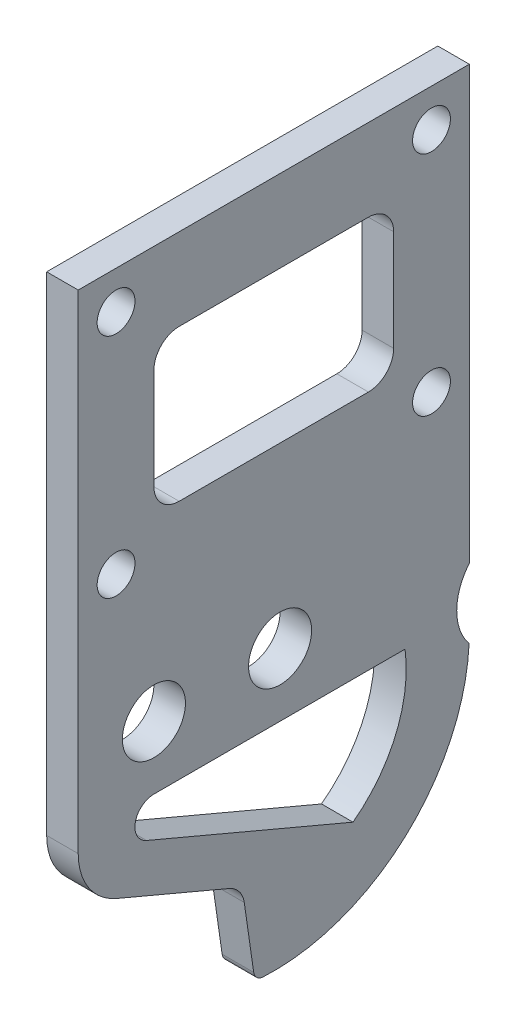
ISO-10303-21;
HEADER;
FILE_DESCRIPTION(('STEP AP214'),'2;1');
FILE_NAME('part.step','',(''),(''),'','','');
FILE_SCHEMA(('AUTOMOTIVE_DESIGN { 1 0 10303 214 1 1 1 1 }'));
ENDSEC;
DATA;
#1=APPLICATION_CONTEXT('core data for automotive mechanical design processes');
#2=APPLICATION_PROTOCOL_DEFINITION('international standard','automotive_design',2000,#1);
#3=PRODUCT_CONTEXT('',#1,'mechanical');
#4=PRODUCT('Part','Part','',(#3));
#5=PRODUCT_RELATED_PRODUCT_CATEGORY('part','',(#4));
#6=PRODUCT_DEFINITION_FORMATION('','',#4);
#7=PRODUCT_DEFINITION_CONTEXT('part definition',#1,'design');
#8=PRODUCT_DEFINITION('design','',#6,#7);
#9=PRODUCT_DEFINITION_SHAPE('','',#8);
#10=(LENGTH_UNIT() NAMED_UNIT(*) SI_UNIT(.MILLI.,.METRE.));
#11=(NAMED_UNIT(*) PLANE_ANGLE_UNIT() SI_UNIT($,.RADIAN.));
#12=(NAMED_UNIT(*) SI_UNIT($,.STERADIAN.) SOLID_ANGLE_UNIT());
#13=UNCERTAINTY_MEASURE_WITH_UNIT(LENGTH_MEASURE(1.E-05),#10,'distance_accuracy_value','');
#14=(GEOMETRIC_REPRESENTATION_CONTEXT(3) GLOBAL_UNCERTAINTY_ASSIGNED_CONTEXT((#13)) GLOBAL_UNIT_ASSIGNED_CONTEXT((#10,
#11,#12)) REPRESENTATION_CONTEXT('',''));
#15=CARTESIAN_POINT('',(0.,0.,0.));
#16=DIRECTION('',(0.,0.,1.));
#17=DIRECTION('',(1.,0.,0.));
#18=AXIS2_PLACEMENT_3D('',#15,#16,#17);
#19=CARTESIAN_POINT('',(-1.25,-26.4282241632523,0.799834616227528));
#20=DIRECTION('',(1.,0.,0.));
#21=DIRECTION('',(0.,0.,-1.));
#22=AXIS2_PLACEMENT_3D('',#19,#20,#21);
#23=CYLINDRICAL_SURFACE('',#22,0.8);
#24=CARTESIAN_POINT('',(1.25,-26.4282241632523,0.799834616227528));
#25=DIRECTION('',(1.,0.,0.));
#26=DIRECTION('',(0.,0.,-1.));
#27=AXIS2_PLACEMENT_3D('',#24,#25,#26);
#28=CIRCLE('',#27,0.8);
#29=CARTESIAN_POINT('',(1.25,-26.5425253052086,1.59162704417029));
#30=VERTEX_POINT('',#29);
#31=CARTESIAN_POINT('',(1.25,-27.2270390837014,0.843363030716107));
#32=VERTEX_POINT('',#31);
#33=EDGE_CURVE('E166',#30,#32,#28,.T.);
#34=ORIENTED_EDGE('',*,*,#33,.F.);
#35=DIRECTION('',(1.,0.,0.));
#36=VECTOR('',#35,1.);
#37=CARTESIAN_POINT('',(-1.25,-26.5425253052086,1.59162704417028));
#38=LINE('',#37,#36);
#39=CARTESIAN_POINT('',(-1.25,-26.5425253052086,1.59162704417029));
#40=VERTEX_POINT('',#39);
#41=EDGE_CURVE('E164',#40,#30,#38,.T.);
#42=ORIENTED_EDGE('',*,*,#41,.F.);
#43=CARTESIAN_POINT('',(-1.25,-26.4282241632523,0.799834616227528));
#44=DIRECTION('',(1.,0.,0.));
#45=DIRECTION('',(0.,0.,-1.));
#46=AXIS2_PLACEMENT_3D('',#43,#44,#45);
#47=CIRCLE('',#46,0.8);
#48=CARTESIAN_POINT('',(-1.25,-27.2270390837014,0.843363030716107));
#49=VERTEX_POINT('',#48);
#50=EDGE_CURVE('E20',#40,#49,#47,.T.);
#51=ORIENTED_EDGE('',*,*,#50,.T.);
#52=DIRECTION('',(1.,0.,0.));
#53=VECTOR('',#52,1.);
#54=CARTESIAN_POINT('',(-1.25,-27.2270390837014,0.843363030716113));
#55=LINE('',#54,#53);
#56=EDGE_CURVE('E163',#32,#49,#55,.F.);
#57=ORIENTED_EDGE('',*,*,#56,.F.);
#58=EDGE_LOOP('',(#34,#42,#51,#57));
#59=FACE_BOUND('',#58,.T.);
#60=ADVANCED_FACE('F17',(#59),#23,.T.);
#61=CARTESIAN_POINT('',(1.25,0.,0.));
#62=DIRECTION('',(1.,0.,0.));
#63=DIRECTION('',(0.,0.,-1.));
#64=AXIS2_PLACEMENT_3D('',#61,#62,#63);
#65=PLANE('',#64);
#66=CARTESIAN_POINT('',(1.25,6.25,-12.5));
#67=DIRECTION('',(1.,0.,0.));
#68=DIRECTION('',(0.,0.,-1.));
#69=AXIS2_PLACEMENT_3D('',#66,#67,#68);
#70=CIRCLE('',#69,1.5);
#71=CARTESIAN_POINT('',(1.25,6.25,-14.));
#72=VERTEX_POINT('',#71);
#73=EDGE_CURVE('E193',#72,#72,#70,.F.);
#74=ORIENTED_EDGE('',*,*,#73,.T.);
#75=EDGE_LOOP('',(#74));
#76=FACE_BOUND('',#75,.T.);
#77=CARTESIAN_POINT('',(1.25,24.25,-12.5));
#78=DIRECTION('',(1.,0.,0.));
#79=DIRECTION('',(0.,0.,-1.));
#80=AXIS2_PLACEMENT_3D('',#77,#78,#79);
#81=CIRCLE('',#80,1.5);
#82=CARTESIAN_POINT('',(1.25,24.25,-14.));
#83=VERTEX_POINT('',#82);
#84=EDGE_CURVE('E196',#83,#83,#81,.F.);
#85=ORIENTED_EDGE('',*,*,#84,.T.);
#86=EDGE_LOOP('',(#85));
#87=FACE_BOUND('',#86,.T.);
#88=CARTESIAN_POINT('',(1.25,24.25,12.5));
#89=DIRECTION('',(1.,0.,0.));
#90=DIRECTION('',(0.,0.,-1.));
#91=AXIS2_PLACEMENT_3D('',#88,#89,#90);
#92=CIRCLE('',#91,1.5);
#93=CARTESIAN_POINT('',(1.25,24.25,11.));
#94=VERTEX_POINT('',#93);
#95=EDGE_CURVE('E201',#94,#94,#92,.F.);
#96=ORIENTED_EDGE('',*,*,#95,.T.);
#97=EDGE_LOOP('',(#96));
#98=FACE_BOUND('',#97,.T.);
#99=CARTESIAN_POINT('',(1.25,6.25,12.5));
#100=DIRECTION('',(1.,0.,0.));
#101=DIRECTION('',(0.,0.,-1.));
#102=AXIS2_PLACEMENT_3D('',#99,#100,#101);
#103=CIRCLE('',#102,1.5);
#104=CARTESIAN_POINT('',(1.25,6.25,11.));
#105=VERTEX_POINT('',#104);
#106=EDGE_CURVE('E206',#105,#105,#103,.F.);
#107=ORIENTED_EDGE('',*,*,#106,.T.);
#108=EDGE_LOOP('',(#107));
#109=FACE_BOUND('',#108,.T.);
#110=CARTESIAN_POINT('',(1.25,-5.35,-0.500000000000004));
#111=DIRECTION('',(1.,0.,0.));
#112=DIRECTION('',(0.,0.,-1.));
#113=AXIS2_PLACEMENT_3D('',#110,#111,#112);
#114=CIRCLE('',#113,2.5);
#115=CARTESIAN_POINT('',(1.25,-5.35,-3.));
#116=VERTEX_POINT('',#115);
#117=EDGE_CURVE('E211',#116,#116,#114,.F.);
#118=ORIENTED_EDGE('',*,*,#117,.T.);
#119=EDGE_LOOP('',(#118));
#120=FACE_BOUND('',#119,.T.);
#121=CARTESIAN_POINT('',(1.25,-5.35,9.5));
#122=DIRECTION('',(1.,0.,0.));
#123=DIRECTION('',(0.,0.,-1.));
#124=AXIS2_PLACEMENT_3D('',#121,#122,#123);
#125=CIRCLE('',#124,2.5);
#126=CARTESIAN_POINT('',(1.25,-5.35,7.));
#127=VERTEX_POINT('',#126);
#128=EDGE_CURVE('E216',#127,#127,#125,.F.);
#129=ORIENTED_EDGE('',*,*,#128,.T.);
#130=EDGE_LOOP('',(#129));
#131=FACE_BOUND('',#130,.T.);
#132=DIRECTION('',(0.,0.,-1.));
#133=VECTOR('',#132,1.);
#134=CARTESIAN_POINT('',(1.25,8.75,7.5));
#135=LINE('',#134,#133);
#136=CARTESIAN_POINT('',(1.25,8.75,-7.5));
#137=VERTEX_POINT('',#136);
#138=CARTESIAN_POINT('',(1.25,8.75,7.5));
#139=VERTEX_POINT('',#138);
#140=EDGE_CURVE('E364',#137,#139,#135,.F.);
#141=ORIENTED_EDGE('',*,*,#140,.T.);
#142=CARTESIAN_POINT('',(1.25,10.75,7.5));
#143=DIRECTION('',(1.,0.,0.));
#144=DIRECTION('',(0.,0.,-1.));
#145=AXIS2_PLACEMENT_3D('',#142,#143,#144);
#146=CIRCLE('',#145,2.);
#147=CARTESIAN_POINT('',(1.25,10.75,9.5));
#148=VERTEX_POINT('',#147);
#149=EDGE_CURVE('E224',#139,#148,#146,.F.);
#150=ORIENTED_EDGE('',*,*,#149,.T.);
#151=DIRECTION('',(0.,-1.,0.));
#152=VECTOR('',#151,1.);
#153=CARTESIAN_POINT('',(1.25,18.75,9.5));
#154=LINE('',#153,#152);
#155=CARTESIAN_POINT('',(1.25,18.75,9.5));
#156=VERTEX_POINT('',#155);
#157=EDGE_CURVE('E221',#148,#156,#154,.F.);
#158=ORIENTED_EDGE('',*,*,#157,.T.);
#159=CARTESIAN_POINT('',(1.25,18.75,7.5));
#160=DIRECTION('',(1.,0.,0.));
#161=DIRECTION('',(0.,0.,-1.));
#162=AXIS2_PLACEMENT_3D('',#159,#160,#161);
#163=CIRCLE('',#162,2.);
#164=CARTESIAN_POINT('',(1.25,20.75,7.5));
#165=VERTEX_POINT('',#164);
#166=EDGE_CURVE('E236',#156,#165,#163,.F.);
#167=ORIENTED_EDGE('',*,*,#166,.T.);
#168=DIRECTION('',(0.,0.,1.));
#169=VECTOR('',#168,1.);
#170=CARTESIAN_POINT('',(1.25,20.75,-7.5));
#171=LINE('',#170,#169);
#172=CARTESIAN_POINT('',(1.25,20.75,-7.5));
#173=VERTEX_POINT('',#172);
#174=EDGE_CURVE('E374',#165,#173,#171,.F.);
#175=ORIENTED_EDGE('',*,*,#174,.T.);
#176=CARTESIAN_POINT('',(1.25,18.75,-7.5));
#177=DIRECTION('',(1.,0.,0.));
#178=DIRECTION('',(0.,0.,-1.));
#179=AXIS2_PLACEMENT_3D('',#176,#177,#178);
#180=CIRCLE('',#179,2.);
#181=CARTESIAN_POINT('',(1.25,18.75,-9.5));
#182=VERTEX_POINT('',#181);
#183=EDGE_CURVE('E232',#173,#182,#180,.F.);
#184=ORIENTED_EDGE('',*,*,#183,.T.);
#185=DIRECTION('',(0.,1.,0.));
#186=VECTOR('',#185,1.);
#187=CARTESIAN_POINT('',(1.25,10.75,-9.5));
#188=LINE('',#187,#186);
#189=CARTESIAN_POINT('',(1.25,10.75,-9.5));
#190=VERTEX_POINT('',#189);
#191=EDGE_CURVE('E369',#182,#190,#188,.F.);
#192=ORIENTED_EDGE('',*,*,#191,.T.);
#193=CARTESIAN_POINT('',(1.25,10.75,-7.5));
#194=DIRECTION('',(1.,0.,0.));
#195=DIRECTION('',(0.,0.,-1.));
#196=AXIS2_PLACEMENT_3D('',#193,#194,#195);
#197=CIRCLE('',#196,2.);
#198=EDGE_CURVE('E228',#190,#137,#197,.F.);
#199=ORIENTED_EDGE('',*,*,#198,.T.);
#200=EDGE_LOOP('',(#141,#150,#158,#167,#175,#184,#192,#199));
#201=FACE_BOUND('',#200,.T.);
#202=CARTESIAN_POINT('',(1.25,-11.75,0.));
#203=DIRECTION('',(1.,0.,0.));
#204=DIRECTION('',(0.,0.,-1.));
#205=AXIS2_PLACEMENT_3D('',#202,#203,#204);
#206=CIRCLE('',#205,10.5);
#207=CARTESIAN_POINT('',(1.25,-10.35,-10.406248123123));
#208=VERTEX_POINT('',#207);
#209=CARTESIAN_POINT('',(1.25,-20.1645162603078,-6.28059838749591));
#210=VERTEX_POINT('',#209);
#211=EDGE_CURVE('E243',#208,#210,#206,.F.);
#212=ORIENTED_EDGE('',*,*,#211,.T.);
#213=DIRECTION('',(0.,-0.389639990836698,-0.920967251068559));
#214=VECTOR('',#213,1.);
#215=CARTESIAN_POINT('',(1.25,-13.2400958497218,10.0862134920709));
#216=LINE('',#215,#214);
#217=CARTESIAN_POINT('',(1.25,-13.2400958497218,10.0862134920709));
#218=VERTEX_POINT('',#217);
#219=EDGE_CURVE('E380',#210,#218,#216,.F.);
#220=ORIENTED_EDGE('',*,*,#219,.T.);
#221=CARTESIAN_POINT('',(1.25,-11.8545003230087,9.49999999999999));
#222=DIRECTION('',(1.,0.,0.));
#223=DIRECTION('',(0.,0.,-1.));
#224=AXIS2_PLACEMENT_3D('',#221,#222,#223);
#225=CIRCLE('',#224,1.50450032300873);
#226=CARTESIAN_POINT('',(1.25,-10.35,9.49999999999999));
#227=VERTEX_POINT('',#226);
#228=EDGE_CURVE('E239',#218,#227,#225,.F.);
#229=ORIENTED_EDGE('',*,*,#228,.T.);
#230=DIRECTION('',(0.,0.,1.));
#231=VECTOR('',#230,1.);
#232=CARTESIAN_POINT('',(1.25,-10.35,-10.406248123123));
#233=LINE('',#232,#231);
#234=EDGE_CURVE('E387',#227,#208,#233,.F.);
#235=ORIENTED_EDGE('',*,*,#234,.T.);
#236=EDGE_LOOP('',(#212,#220,#229,#235));
#237=FACE_BOUND('',#236,.T.);
#238=DIRECTION('',(0.,-1.,0.));
#239=VECTOR('',#238,1.);
#240=CARTESIAN_POINT('',(1.25,27.25,15.5));
#241=LINE('',#240,#239);
#242=CARTESIAN_POINT('',(1.25,-11.4363099178873,15.5));
#243=VERTEX_POINT('',#242);
#244=CARTESIAN_POINT('',(1.25,27.25,15.5));
#245=VERTEX_POINT('',#244);
#246=EDGE_CURVE('E392',#243,#245,#241,.F.);
#247=ORIENTED_EDGE('',*,*,#246,.F.);
#248=CARTESIAN_POINT('',(1.25,-11.4363099178873,10.5));
#249=DIRECTION('',(1.,0.,0.));
#250=DIRECTION('',(0.,0.,-1.));
#251=AXIS2_PLACEMENT_3D('',#248,#249,#250);
#252=CIRCLE('',#251,5.);
#253=CARTESIAN_POINT('',(1.25,-16.0411461732301,12.4481999541835));
#254=VERTEX_POINT('',#253);
#255=EDGE_CURVE('E247',#254,#243,#252,.F.);
#256=ORIENTED_EDGE('',*,*,#255,.F.);
#257=DIRECTION('',(0.,-0.389639990836698,-0.920967251068559));
#258=VECTOR('',#257,1.);
#259=CARTESIAN_POINT('',(1.25,-16.0411461732301,12.4481999541835));
#260=LINE('',#259,#258);
#261=CARTESIAN_POINT('',(1.25,-19.810418179431,3.53901157589053));
#262=VERTEX_POINT('',#261);
#263=EDGE_CURVE('E260',#262,#254,#260,.F.);
#264=ORIENTED_EDGE('',*,*,#263,.F.);
#265=CARTESIAN_POINT('',(1.25,-21.6523526815681,4.31829155756391));
#266=DIRECTION('',(-1.,0.,0.));
#267=DIRECTION('',(0.,0.,1.));
#268=AXIS2_PLACEMENT_3D('',#265,#266,#267);
#269=CIRCLE('',#268,2.);
#270=CARTESIAN_POINT('',(1.25,-21.3665998266774,2.33881048770699));
#271=VERTEX_POINT('',#270);
#272=EDGE_CURVE('E257',#262,#271,#269,.T.);
#273=ORIENTED_EDGE('',*,*,#272,.T.);
#274=DIRECTION('',(0.,-0.989740534928455,-0.142876427445314));
#275=VECTOR('',#274,1.);
#276=CARTESIAN_POINT('',(1.25,-21.3665998266774,2.338810487707));
#277=LINE('',#276,#275);
#278=EDGE_CURVE('E283',#30,#271,#277,.F.);
#279=ORIENTED_EDGE('',*,*,#278,.F.);
#280=ORIENTED_EDGE('',*,*,#33,.T.);
#281=CARTESIAN_POINT('',(1.25,-11.75,0.));
#282=DIRECTION('',(1.,0.,0.));
#283=DIRECTION('',(0.,0.,-1.));
#284=AXIS2_PLACEMENT_3D('',#281,#282,#283);
#285=CIRCLE('',#284,15.5);
#286=CARTESIAN_POINT('',(1.25,-12.5,-15.481844205391));
#287=VERTEX_POINT('',#286);
#288=EDGE_CURVE('E173',#287,#32,#285,.F.);
#289=ORIENTED_EDGE('',*,*,#288,.F.);
#290=CARTESIAN_POINT('',(1.25,-9.76096105194015,-18.8113928928354));
#291=DIRECTION('',(-1.,0.,0.));
#292=DIRECTION('',(0.,0.,1.));
#293=AXIS2_PLACEMENT_3D('',#290,#291,#292);
#294=CIRCLE('',#293,4.31140682620549);
#295=CARTESIAN_POINT('',(1.25,-7.,-15.5));
#296=VERTEX_POINT('',#295);
#297=EDGE_CURVE('E251',#287,#296,#294,.T.);
#298=ORIENTED_EDGE('',*,*,#297,.T.);
#299=DIRECTION('',(0.,1.,0.));
#300=VECTOR('',#299,1.);
#301=CARTESIAN_POINT('',(1.25,-7.,-15.5));
#302=LINE('',#301,#300);
#303=CARTESIAN_POINT('',(1.25,27.25,-15.5));
#304=VERTEX_POINT('',#303);
#305=EDGE_CURVE('E254',#304,#296,#302,.F.);
#306=ORIENTED_EDGE('',*,*,#305,.F.);
#307=DIRECTION('',(0.,0.,1.));
#308=VECTOR('',#307,1.);
#309=CARTESIAN_POINT('',(1.25,27.25,-15.5));
#310=LINE('',#309,#308);
#311=EDGE_CURVE('E273',#245,#304,#310,.F.);
#312=ORIENTED_EDGE('',*,*,#311,.F.);
#313=EDGE_LOOP('',(#247,#256,#264,#273,#279,#280,#289,#298,#306,#312));
#314=FACE_BOUND('',#313,.T.);
#315=ADVANCED_FACE('F419',(#76,#87,#98,#109,#120,#131,#201,#237,#314),#65,.T.);
#316=CARTESIAN_POINT('',(-1.25,-16.0411461732301,12.4481999541835));
#317=DIRECTION('',(0.,-0.920967251068559,0.389639990836698));
#318=DIRECTION('',(0.,-0.389639990836698,-0.920967251068559));
#319=AXIS2_PLACEMENT_3D('',#316,#317,#318);
#320=PLANE('',#319);
#321=ORIENTED_EDGE('',*,*,#263,.T.);
#322=DIRECTION('',(1.,0.,0.));
#323=VECTOR('',#322,1.);
#324=CARTESIAN_POINT('',(-1.25,-16.0411461732301,12.4481999541835));
#325=LINE('',#324,#323);
#326=CARTESIAN_POINT('',(-1.25,-16.0411461732301,12.4481999541835));
#327=VERTEX_POINT('',#326);
#328=EDGE_CURVE('E250',#327,#254,#325,.T.);
#329=ORIENTED_EDGE('',*,*,#328,.F.);
#330=DIRECTION('',(0.,-0.389639990836691,-0.920967251068562));
#331=VECTOR('',#330,1.);
#332=CARTESIAN_POINT('',(-1.25,-16.0411461732301,12.4481999541835));
#333=LINE('',#332,#331);
#334=CARTESIAN_POINT('',(-1.25,-19.8104181794309,3.53901157589052));
#335=VERTEX_POINT('',#334);
#336=EDGE_CURVE('E192',#327,#335,#333,.T.);
#337=ORIENTED_EDGE('',*,*,#336,.T.);
#338=DIRECTION('',(-1.,0.,0.));
#339=VECTOR('',#338,1.);
#340=CARTESIAN_POINT('',(-1.25,-19.810418179431,3.53901157589055));
#341=LINE('',#340,#339);
#342=EDGE_CURVE('E259',#335,#262,#341,.F.);
#343=ORIENTED_EDGE('',*,*,#342,.T.);
#344=EDGE_LOOP('',(#321,#329,#337,#343));
#345=FACE_BOUND('',#344,.T.);
#346=ADVANCED_FACE('F694',(#345),#320,.T.);
#347=CARTESIAN_POINT('',(-1.25,-21.6523526815681,4.31829155756391));
#348=DIRECTION('',(-1.,0.,0.));
#349=DIRECTION('',(0.,0.,1.));
#350=AXIS2_PLACEMENT_3D('',#347,#348,#349);
#351=CYLINDRICAL_SURFACE('',#350,2.);
#352=DIRECTION('',(1.,0.,0.));
#353=VECTOR('',#352,1.);
#354=CARTESIAN_POINT('',(-1.25,-21.3665998266774,2.338810487707));
#355=LINE('',#354,#353);
#356=CARTESIAN_POINT('',(-1.25,-21.3665998266774,2.33881048770699));
#357=VERTEX_POINT('',#356);
#358=EDGE_CURVE('E256',#271,#357,#355,.F.);
#359=ORIENTED_EDGE('',*,*,#358,.F.);
#360=ORIENTED_EDGE('',*,*,#272,.F.);
#361=ORIENTED_EDGE('',*,*,#342,.F.);
#362=CARTESIAN_POINT('',(-1.25,-21.6523526815681,4.31829155756391));
#363=DIRECTION('',(-1.,0.,0.));
#364=DIRECTION('',(0.,0.,1.));
#365=AXIS2_PLACEMENT_3D('',#362,#363,#364);
#366=CIRCLE('',#365,2.);
#367=EDGE_CURVE('E186',#335,#357,#366,.T.);
#368=ORIENTED_EDGE('',*,*,#367,.T.);
#369=EDGE_LOOP('',(#359,#360,#361,#368));
#370=FACE_BOUND('',#369,.T.);
#371=ADVANCED_FACE('F685',(#370),#351,.F.);
#372=CARTESIAN_POINT('',(-1.25,-21.3665998266774,2.338810487707));
#373=DIRECTION('',(0.,-0.142876427445314,0.989740534928455));
#374=DIRECTION('',(0.,-0.989740534928455,-0.142876427445314));
#375=AXIS2_PLACEMENT_3D('',#372,#373,#374);
#376=PLANE('',#375);
#377=ORIENTED_EDGE('',*,*,#278,.T.);
#378=ORIENTED_EDGE('',*,*,#358,.T.);
#379=DIRECTION('',(0.,-0.989740534928455,-0.142876427445313));
#380=VECTOR('',#379,1.);
#381=CARTESIAN_POINT('',(-1.25,-21.3665998266774,2.338810487707));
#382=LINE('',#381,#380);
#383=EDGE_CURVE('E182',#357,#40,#382,.T.);
#384=ORIENTED_EDGE('',*,*,#383,.T.);
#385=ORIENTED_EDGE('',*,*,#41,.T.);
#386=EDGE_LOOP('',(#377,#378,#384,#385));
#387=FACE_BOUND('',#386,.T.);
#388=ADVANCED_FACE('F440',(#387),#376,.T.);
#389=CARTESIAN_POINT('',(-1.25,-11.75,0.));
#390=DIRECTION('',(1.,0.,0.));
#391=DIRECTION('',(0.,0.,-1.));
#392=AXIS2_PLACEMENT_3D('',#389,#390,#391);
#393=CYLINDRICAL_SURFACE('',#392,15.5);
#394=ORIENTED_EDGE('',*,*,#288,.T.);
#395=ORIENTED_EDGE('',*,*,#56,.T.);
#396=CARTESIAN_POINT('',(-1.25,-11.75,0.));
#397=DIRECTION('',(1.,0.,0.));
#398=DIRECTION('',(0.,0.,-1.));
#399=AXIS2_PLACEMENT_3D('',#396,#397,#398);
#400=CIRCLE('',#399,15.5);
#401=CARTESIAN_POINT('',(-1.25,-12.5,-15.481844205391));
#402=VERTEX_POINT('',#401);
#403=EDGE_CURVE('E172',#49,#402,#400,.T.);
#404=ORIENTED_EDGE('',*,*,#403,.T.);
#405=DIRECTION('',(-1.,0.,0.));
#406=VECTOR('',#405,1.);
#407=CARTESIAN_POINT('',(-1.25,-12.5,-15.481844205391));
#408=LINE('',#407,#406);
#409=EDGE_CURVE('E174',#402,#287,#408,.F.);
#410=ORIENTED_EDGE('',*,*,#409,.T.);
#411=EDGE_LOOP('',(#394,#395,#404,#410));
#412=FACE_BOUND('',#411,.T.);
#413=ADVANCED_FACE('F170',(#412),#393,.T.);
#414=CARTESIAN_POINT('',(-1.25,-9.76096105194015,-18.8113928928354));
#415=DIRECTION('',(-1.,0.,0.));
#416=DIRECTION('',(0.,0.,1.));
#417=AXIS2_PLACEMENT_3D('',#414,#415,#416);
#418=CYLINDRICAL_SURFACE('',#417,4.31140682620549);
#419=DIRECTION('',(1.,0.,0.));
#420=VECTOR('',#419,1.);
#421=CARTESIAN_POINT('',(-1.25,-7.,-15.5));
#422=LINE('',#421,#420);
#423=CARTESIAN_POINT('',(-1.25,-7.,-15.5));
#424=VERTEX_POINT('',#423);
#425=EDGE_CURVE('E277',#296,#424,#422,.F.);
#426=ORIENTED_EDGE('',*,*,#425,.F.);
#427=ORIENTED_EDGE('',*,*,#297,.F.);
#428=ORIENTED_EDGE('',*,*,#409,.F.);
#429=CARTESIAN_POINT('',(-1.25,-9.76096105194015,-18.8113928928354));
#430=DIRECTION('',(-1.,0.,0.));
#431=DIRECTION('',(0.,0.,1.));
#432=AXIS2_PLACEMENT_3D('',#429,#430,#431);
#433=CIRCLE('',#432,4.31140682620549);
#434=EDGE_CURVE('E181',#402,#424,#433,.T.);
#435=ORIENTED_EDGE('',*,*,#434,.T.);
#436=EDGE_LOOP('',(#426,#427,#428,#435));
#437=FACE_BOUND('',#436,.T.);
#438=ADVANCED_FACE('F431',(#437),#418,.F.);
#439=CARTESIAN_POINT('',(-1.25,-7.,-15.5));
#440=DIRECTION('',(0.,0.,-1.));
#441=DIRECTION('',(0.,1.,0.));
#442=AXIS2_PLACEMENT_3D('',#439,#440,#441);
#443=PLANE('',#442);
#444=ORIENTED_EDGE('',*,*,#305,.T.);
#445=ORIENTED_EDGE('',*,*,#425,.T.);
#446=DIRECTION('',(0.,1.,0.));
#447=VECTOR('',#446,1.);
#448=CARTESIAN_POINT('',(-1.25,0.,-15.5));
#449=LINE('',#448,#447);
#450=CARTESIAN_POINT('',(-1.25,27.25,-15.5));
#451=VERTEX_POINT('',#450);
#452=EDGE_CURVE('E184',#424,#451,#449,.T.);
#453=ORIENTED_EDGE('',*,*,#452,.T.);
#454=DIRECTION('',(1.,0.,0.));
#455=VECTOR('',#454,1.);
#456=CARTESIAN_POINT('',(-1.25,27.25,-15.5));
#457=LINE('',#456,#455);
#458=EDGE_CURVE('E276',#304,#451,#457,.F.);
#459=ORIENTED_EDGE('',*,*,#458,.F.);
#460=EDGE_LOOP('',(#444,#445,#453,#459));
#461=FACE_BOUND('',#460,.T.);
#462=ADVANCED_FACE('F427',(#461),#443,.T.);
#463=CARTESIAN_POINT('',(-1.25,27.25,-15.5));
#464=DIRECTION('',(0.,1.,0.));
#465=DIRECTION('',(0.,0.,1.));
#466=AXIS2_PLACEMENT_3D('',#463,#464,#465);
#467=PLANE('',#466);
#468=ORIENTED_EDGE('',*,*,#311,.T.);
#469=ORIENTED_EDGE('',*,*,#458,.T.);
#470=DIRECTION('',(0.,0.,-1.));
#471=VECTOR('',#470,1.);
#472=CARTESIAN_POINT('',(-1.25,27.25,0.));
#473=LINE('',#472,#471);
#474=CARTESIAN_POINT('',(-1.25,27.25,15.5));
#475=VERTEX_POINT('',#474);
#476=EDGE_CURVE('E342',#451,#475,#473,.F.);
#477=ORIENTED_EDGE('',*,*,#476,.T.);
#478=DIRECTION('',(1.,0.,0.));
#479=VECTOR('',#478,1.);
#480=CARTESIAN_POINT('',(-1.25,27.25,15.5));
#481=LINE('',#480,#479);
#482=EDGE_CURVE('E390',#245,#475,#481,.F.);
#483=ORIENTED_EDGE('',*,*,#482,.F.);
#484=EDGE_LOOP('',(#468,#469,#477,#483));
#485=FACE_BOUND('',#484,.T.);
#486=ADVANCED_FACE('F422',(#485),#467,.T.);
#487=CARTESIAN_POINT('',(-1.25,27.25,15.5));
#488=DIRECTION('',(0.,0.,1.));
#489=DIRECTION('',(0.,-1.,0.));
#490=AXIS2_PLACEMENT_3D('',#487,#488,#489);
#491=PLANE('',#490);
#492=ORIENTED_EDGE('',*,*,#246,.T.);
#493=ORIENTED_EDGE('',*,*,#482,.T.);
#494=DIRECTION('',(0.,1.,0.));
#495=VECTOR('',#494,1.);
#496=CARTESIAN_POINT('',(-1.25,0.,15.5));
#497=LINE('',#496,#495);
#498=CARTESIAN_POINT('',(-1.25,-11.4363099178873,15.5));
#499=VERTEX_POINT('',#498);
#500=EDGE_CURVE('E336',#475,#499,#497,.F.);
#501=ORIENTED_EDGE('',*,*,#500,.T.);
#502=DIRECTION('',(1.,0.,0.));
#503=VECTOR('',#502,1.);
#504=CARTESIAN_POINT('',(-1.25,-11.4363099178873,15.5));
#505=LINE('',#504,#503);
#506=EDGE_CURVE('E249',#243,#499,#505,.F.);
#507=ORIENTED_EDGE('',*,*,#506,.F.);
#508=EDGE_LOOP('',(#492,#493,#501,#507));
#509=FACE_BOUND('',#508,.T.);
#510=ADVANCED_FACE('F414',(#509),#491,.T.);
#511=CARTESIAN_POINT('',(-1.25,-11.4363099178873,10.5));
#512=DIRECTION('',(1.,0.,0.));
#513=DIRECTION('',(0.,0.,-1.));
#514=AXIS2_PLACEMENT_3D('',#511,#512,#513);
#515=CYLINDRICAL_SURFACE('',#514,5.);
#516=ORIENTED_EDGE('',*,*,#255,.T.);
#517=ORIENTED_EDGE('',*,*,#506,.T.);
#518=CARTESIAN_POINT('',(-1.25,-11.4363099178873,10.5));
#519=DIRECTION('',(1.,0.,0.));
#520=DIRECTION('',(0.,0.,-1.));
#521=AXIS2_PLACEMENT_3D('',#518,#519,#520);
#522=CIRCLE('',#521,5.);
#523=EDGE_CURVE('E334',#499,#327,#522,.T.);
#524=ORIENTED_EDGE('',*,*,#523,.T.);
#525=ORIENTED_EDGE('',*,*,#328,.T.);
#526=EDGE_LOOP('',(#516,#517,#524,#525));
#527=FACE_BOUND('',#526,.T.);
#528=ADVANCED_FACE('F520',(#527),#515,.T.);
#529=CARTESIAN_POINT('',(-1.25,-10.35,-10.406248123123));
#530=DIRECTION('',(0.,1.,0.));
#531=DIRECTION('',(0.,0.,1.));
#532=AXIS2_PLACEMENT_3D('',#529,#530,#531);
#533=PLANE('',#532);
#534=DIRECTION('',(1.,0.,0.));
#535=VECTOR('',#534,1.);
#536=CARTESIAN_POINT('',(-1.25,-10.35,9.49999999999999));
#537=LINE('',#536,#535);
#538=CARTESIAN_POINT('',(-1.25,-10.35,9.49999999999999));
#539=VERTEX_POINT('',#538);
#540=EDGE_CURVE('E377',#227,#539,#537,.F.);
#541=ORIENTED_EDGE('',*,*,#540,.T.);
#542=DIRECTION('',(0.,0.,-1.));
#543=VECTOR('',#542,1.);
#544=CARTESIAN_POINT('',(-1.25,-10.35,0.));
#545=LINE('',#544,#543);
#546=CARTESIAN_POINT('',(-1.25,-10.35,-10.406248123123));
#547=VERTEX_POINT('',#546);
#548=EDGE_CURVE('E333',#539,#547,#545,.T.);
#549=ORIENTED_EDGE('',*,*,#548,.T.);
#550=DIRECTION('',(1.,0.,0.));
#551=VECTOR('',#550,1.);
#552=CARTESIAN_POINT('',(-1.25,-10.35,-10.406248123123));
#553=LINE('',#552,#551);
#554=EDGE_CURVE('E246',#547,#208,#553,.T.);
#555=ORIENTED_EDGE('',*,*,#554,.T.);
#556=ORIENTED_EDGE('',*,*,#234,.F.);
#557=EDGE_LOOP('',(#541,#549,#555,#556));
#558=FACE_BOUND('',#557,.T.);
#559=ADVANCED_FACE('F516',(#558),#533,.F.);
#560=CARTESIAN_POINT('',(-1.25,-11.75,0.));
#561=DIRECTION('',(1.,0.,0.));
#562=DIRECTION('',(0.,0.,-1.));
#563=AXIS2_PLACEMENT_3D('',#560,#561,#562);
#564=CYLINDRICAL_SURFACE('',#563,10.5);
#565=ORIENTED_EDGE('',*,*,#554,.F.);
#566=CARTESIAN_POINT('',(-1.25,-11.75,0.));
#567=DIRECTION('',(1.,0.,0.));
#568=DIRECTION('',(0.,0.,-1.));
#569=AXIS2_PLACEMENT_3D('',#566,#567,#568);
#570=CIRCLE('',#569,10.5);
#571=CARTESIAN_POINT('',(-1.25,-20.1645162603078,-6.28059838749588));
#572=VERTEX_POINT('',#571);
#573=EDGE_CURVE('E331',#547,#572,#570,.F.);
#574=ORIENTED_EDGE('',*,*,#573,.T.);
#575=DIRECTION('',(1.,0.,0.));
#576=VECTOR('',#575,1.);
#577=CARTESIAN_POINT('',(-1.25,-20.1645162603077,-6.28059838749589));
#578=LINE('',#577,#576);
#579=EDGE_CURVE('E245',#572,#210,#578,.T.);
#580=ORIENTED_EDGE('',*,*,#579,.T.);
#581=ORIENTED_EDGE('',*,*,#211,.F.);
#582=EDGE_LOOP('',(#565,#574,#580,#581));
#583=FACE_BOUND('',#582,.T.);
#584=ADVANCED_FACE('F512',(#583),#564,.F.);
#585=CARTESIAN_POINT('',(-1.25,-13.2400958497218,10.0862134920709));
#586=DIRECTION('',(0.,-0.920967251068559,0.389639990836698));
#587=DIRECTION('',(0.,-0.389639990836698,-0.920967251068559));
#588=AXIS2_PLACEMENT_3D('',#585,#586,#587);
#589=PLANE('',#588);
#590=ORIENTED_EDGE('',*,*,#579,.F.);
#591=DIRECTION('',(0.,0.389639990836701,0.920967251068558));
#592=VECTOR('',#591,1.);
#593=CARTESIAN_POINT('',(-1.25,-20.1645162603078,-6.28059838749587));
#594=LINE('',#593,#592);
#595=CARTESIAN_POINT('',(-1.25,-13.2400958497218,10.0862134920709));
#596=VERTEX_POINT('',#595);
#597=EDGE_CURVE('E330',#572,#596,#594,.T.);
#598=ORIENTED_EDGE('',*,*,#597,.T.);
#599=DIRECTION('',(1.,0.,0.));
#600=VECTOR('',#599,1.);
#601=CARTESIAN_POINT('',(-1.25,-13.2400958497218,10.0862134920709));
#602=LINE('',#601,#600);
#603=EDGE_CURVE('E242',#596,#218,#602,.T.);
#604=ORIENTED_EDGE('',*,*,#603,.T.);
#605=ORIENTED_EDGE('',*,*,#219,.F.);
#606=EDGE_LOOP('',(#590,#598,#604,#605));
#607=FACE_BOUND('',#606,.T.);
#608=ADVANCED_FACE('F508',(#607),#589,.F.);
#609=CARTESIAN_POINT('',(-1.25,-11.8545003230087,9.49999999999999));
#610=DIRECTION('',(1.,0.,0.));
#611=DIRECTION('',(0.,0.,-1.));
#612=AXIS2_PLACEMENT_3D('',#609,#610,#611);
#613=CYLINDRICAL_SURFACE('',#612,1.50450032300873);
#614=ORIENTED_EDGE('',*,*,#603,.F.);
#615=CARTESIAN_POINT('',(-1.25,-11.8545003230087,9.49999999999999));
#616=DIRECTION('',(1.,0.,0.));
#617=DIRECTION('',(0.,0.,-1.));
#618=AXIS2_PLACEMENT_3D('',#615,#616,#617);
#619=CIRCLE('',#618,1.50450032300873);
#620=EDGE_CURVE('E327',#596,#539,#619,.F.);
#621=ORIENTED_EDGE('',*,*,#620,.T.);
#622=ORIENTED_EDGE('',*,*,#540,.F.);
#623=ORIENTED_EDGE('',*,*,#228,.F.);
#624=EDGE_LOOP('',(#614,#621,#622,#623));
#625=FACE_BOUND('',#624,.T.);
#626=ADVANCED_FACE('F504',(#625),#613,.F.);
#627=CARTESIAN_POINT('',(-1.25,18.75,7.5));
#628=DIRECTION('',(1.,0.,0.));
#629=DIRECTION('',(0.,0.,-1.));
#630=AXIS2_PLACEMENT_3D('',#627,#628,#629);
#631=CYLINDRICAL_SURFACE('',#630,2.);
#632=DIRECTION('',(1.,0.,0.));
#633=VECTOR('',#632,1.);
#634=CARTESIAN_POINT('',(-1.25,18.75,9.5));
#635=LINE('',#634,#633);
#636=CARTESIAN_POINT('',(-1.25,18.75,9.5));
#637=VERTEX_POINT('',#636);
#638=EDGE_CURVE('E226',#156,#637,#635,.F.);
#639=ORIENTED_EDGE('',*,*,#638,.T.);
#640=CARTESIAN_POINT('',(-1.25,18.75,7.5));
#641=DIRECTION('',(1.,0.,0.));
#642=DIRECTION('',(0.,0.,-1.));
#643=AXIS2_PLACEMENT_3D('',#640,#641,#642);
#644=CIRCLE('',#643,2.);
#645=CARTESIAN_POINT('',(-1.25,20.75,7.5));
#646=VERTEX_POINT('',#645);
#647=EDGE_CURVE('E324',#637,#646,#644,.F.);
#648=ORIENTED_EDGE('',*,*,#647,.T.);
#649=DIRECTION('',(1.,0.,0.));
#650=VECTOR('',#649,1.);
#651=CARTESIAN_POINT('',(-1.25,20.75,7.5));
#652=LINE('',#651,#650);
#653=EDGE_CURVE('E238',#646,#165,#652,.T.);
#654=ORIENTED_EDGE('',*,*,#653,.T.);
#655=ORIENTED_EDGE('',*,*,#166,.F.);
#656=EDGE_LOOP('',(#639,#648,#654,#655));
#657=FACE_BOUND('',#656,.T.);
#658=ADVANCED_FACE('F500',(#657),#631,.F.);
#659=CARTESIAN_POINT('',(-1.25,20.75,-7.5));
#660=DIRECTION('',(0.,1.,0.));
#661=DIRECTION('',(0.,0.,1.));
#662=AXIS2_PLACEMENT_3D('',#659,#660,#661);
#663=PLANE('',#662);
#664=ORIENTED_EDGE('',*,*,#653,.F.);
#665=DIRECTION('',(0.,0.,-1.));
#666=VECTOR('',#665,1.);
#667=CARTESIAN_POINT('',(-1.25,20.75,0.));
#668=LINE('',#667,#666);
#669=CARTESIAN_POINT('',(-1.25,20.75,-7.5));
#670=VERTEX_POINT('',#669);
#671=EDGE_CURVE('E323',#646,#670,#668,.T.);
#672=ORIENTED_EDGE('',*,*,#671,.T.);
#673=DIRECTION('',(1.,0.,0.));
#674=VECTOR('',#673,1.);
#675=CARTESIAN_POINT('',(-1.25,20.75,-7.5));
#676=LINE('',#675,#674);
#677=EDGE_CURVE('E235',#670,#173,#676,.T.);
#678=ORIENTED_EDGE('',*,*,#677,.T.);
#679=ORIENTED_EDGE('',*,*,#174,.F.);
#680=EDGE_LOOP('',(#664,#672,#678,#679));
#681=FACE_BOUND('',#680,.T.);
#682=ADVANCED_FACE('F496',(#681),#663,.F.);
#683=CARTESIAN_POINT('',(-1.25,18.75,-7.5));
#684=DIRECTION('',(1.,0.,0.));
#685=DIRECTION('',(0.,0.,-1.));
#686=AXIS2_PLACEMENT_3D('',#683,#684,#685);
#687=CYLINDRICAL_SURFACE('',#686,2.);
#688=ORIENTED_EDGE('',*,*,#677,.F.);
#689=CARTESIAN_POINT('',(-1.25,18.75,-7.5));
#690=DIRECTION('',(1.,0.,0.));
#691=DIRECTION('',(0.,0.,-1.));
#692=AXIS2_PLACEMENT_3D('',#689,#690,#691);
#693=CIRCLE('',#692,2.);
#694=CARTESIAN_POINT('',(-1.25,18.75,-9.5));
#695=VERTEX_POINT('',#694);
#696=EDGE_CURVE('E320',#670,#695,#693,.F.);
#697=ORIENTED_EDGE('',*,*,#696,.T.);
#698=DIRECTION('',(1.,0.,0.));
#699=VECTOR('',#698,1.);
#700=CARTESIAN_POINT('',(-1.25,18.75,-9.5));
#701=LINE('',#700,#699);
#702=EDGE_CURVE('E234',#695,#182,#701,.T.);
#703=ORIENTED_EDGE('',*,*,#702,.T.);
#704=ORIENTED_EDGE('',*,*,#183,.F.);
#705=EDGE_LOOP('',(#688,#697,#703,#704));
#706=FACE_BOUND('',#705,.T.);
#707=ADVANCED_FACE('F492',(#706),#687,.F.);
#708=CARTESIAN_POINT('',(-1.25,10.75,-9.5));
#709=DIRECTION('',(0.,0.,-1.));
#710=DIRECTION('',(0.,1.,0.));
#711=AXIS2_PLACEMENT_3D('',#708,#709,#710);
#712=PLANE('',#711);
#713=ORIENTED_EDGE('',*,*,#702,.F.);
#714=DIRECTION('',(0.,1.,0.));
#715=VECTOR('',#714,1.);
#716=CARTESIAN_POINT('',(-1.25,0.,-9.5));
#717=LINE('',#716,#715);
#718=CARTESIAN_POINT('',(-1.25,10.75,-9.5));
#719=VERTEX_POINT('',#718);
#720=EDGE_CURVE('E319',#695,#719,#717,.F.);
#721=ORIENTED_EDGE('',*,*,#720,.T.);
#722=DIRECTION('',(1.,0.,0.));
#723=VECTOR('',#722,1.);
#724=CARTESIAN_POINT('',(-1.25,10.75,-9.5));
#725=LINE('',#724,#723);
#726=EDGE_CURVE('E231',#719,#190,#725,.T.);
#727=ORIENTED_EDGE('',*,*,#726,.T.);
#728=ORIENTED_EDGE('',*,*,#191,.F.);
#729=EDGE_LOOP('',(#713,#721,#727,#728));
#730=FACE_BOUND('',#729,.T.);
#731=ADVANCED_FACE('F488',(#730),#712,.F.);
#732=CARTESIAN_POINT('',(-1.25,10.75,-7.5));
#733=DIRECTION('',(1.,0.,0.));
#734=DIRECTION('',(0.,0.,-1.));
#735=AXIS2_PLACEMENT_3D('',#732,#733,#734);
#736=CYLINDRICAL_SURFACE('',#735,2.);
#737=ORIENTED_EDGE('',*,*,#726,.F.);
#738=CARTESIAN_POINT('',(-1.25,10.75,-7.5));
#739=DIRECTION('',(1.,0.,0.));
#740=DIRECTION('',(0.,0.,-1.));
#741=AXIS2_PLACEMENT_3D('',#738,#739,#740);
#742=CIRCLE('',#741,2.);
#743=CARTESIAN_POINT('',(-1.25,8.75,-7.5));
#744=VERTEX_POINT('',#743);
#745=EDGE_CURVE('E316',#719,#744,#742,.F.);
#746=ORIENTED_EDGE('',*,*,#745,.T.);
#747=DIRECTION('',(1.,0.,0.));
#748=VECTOR('',#747,1.);
#749=CARTESIAN_POINT('',(-1.25,8.75,-7.5));
#750=LINE('',#749,#748);
#751=EDGE_CURVE('E230',#744,#137,#750,.T.);
#752=ORIENTED_EDGE('',*,*,#751,.T.);
#753=ORIENTED_EDGE('',*,*,#198,.F.);
#754=EDGE_LOOP('',(#737,#746,#752,#753));
#755=FACE_BOUND('',#754,.T.);
#756=ADVANCED_FACE('F484',(#755),#736,.F.);
#757=CARTESIAN_POINT('',(-1.25,8.75,7.5));
#758=DIRECTION('',(0.,-1.,0.));
#759=DIRECTION('',(0.,0.,-1.));
#760=AXIS2_PLACEMENT_3D('',#757,#758,#759);
#761=PLANE('',#760);
#762=ORIENTED_EDGE('',*,*,#751,.F.);
#763=DIRECTION('',(0.,0.,-1.));
#764=VECTOR('',#763,1.);
#765=CARTESIAN_POINT('',(-1.25,8.75,0.));
#766=LINE('',#765,#764);
#767=CARTESIAN_POINT('',(-1.25,8.75,7.5));
#768=VERTEX_POINT('',#767);
#769=EDGE_CURVE('E315',#744,#768,#766,.F.);
#770=ORIENTED_EDGE('',*,*,#769,.T.);
#771=DIRECTION('',(1.,0.,0.));
#772=VECTOR('',#771,1.);
#773=CARTESIAN_POINT('',(-1.25,8.75,7.5));
#774=LINE('',#773,#772);
#775=EDGE_CURVE('E227',#768,#139,#774,.T.);
#776=ORIENTED_EDGE('',*,*,#775,.T.);
#777=ORIENTED_EDGE('',*,*,#140,.F.);
#778=EDGE_LOOP('',(#762,#770,#776,#777));
#779=FACE_BOUND('',#778,.T.);
#780=ADVANCED_FACE('F480',(#779),#761,.F.);
#781=CARTESIAN_POINT('',(-1.25,10.75,7.5));
#782=DIRECTION('',(1.,0.,0.));
#783=DIRECTION('',(0.,0.,-1.));
#784=AXIS2_PLACEMENT_3D('',#781,#782,#783);
#785=CYLINDRICAL_SURFACE('',#784,2.);
#786=ORIENTED_EDGE('',*,*,#775,.F.);
#787=CARTESIAN_POINT('',(-1.25,10.75,7.5));
#788=DIRECTION('',(1.,0.,0.));
#789=DIRECTION('',(0.,0.,-1.));
#790=AXIS2_PLACEMENT_3D('',#787,#788,#789);
#791=CIRCLE('',#790,2.);
#792=CARTESIAN_POINT('',(-1.25,10.75,9.5));
#793=VERTEX_POINT('',#792);
#794=EDGE_CURVE('E312',#768,#793,#791,.F.);
#795=ORIENTED_EDGE('',*,*,#794,.T.);
#796=DIRECTION('',(1.,0.,0.));
#797=VECTOR('',#796,1.);
#798=CARTESIAN_POINT('',(-1.25,10.75,9.5));
#799=LINE('',#798,#797);
#800=EDGE_CURVE('E35',#793,#148,#799,.T.);
#801=ORIENTED_EDGE('',*,*,#800,.T.);
#802=ORIENTED_EDGE('',*,*,#149,.F.);
#803=EDGE_LOOP('',(#786,#795,#801,#802));
#804=FACE_BOUND('',#803,.T.);
#805=ADVANCED_FACE('F477',(#804),#785,.F.);
#806=CARTESIAN_POINT('',(-1.25,18.75,9.5));
#807=DIRECTION('',(0.,0.,1.));
#808=DIRECTION('',(0.,-1.,0.));
#809=AXIS2_PLACEMENT_3D('',#806,#807,#808);
#810=PLANE('',#809);
#811=ORIENTED_EDGE('',*,*,#800,.F.);
#812=DIRECTION('',(0.,1.,0.));
#813=VECTOR('',#812,1.);
#814=CARTESIAN_POINT('',(-1.25,0.,9.5));
#815=LINE('',#814,#813);
#816=EDGE_CURVE('E309',#793,#637,#815,.T.);
#817=ORIENTED_EDGE('',*,*,#816,.T.);
#818=ORIENTED_EDGE('',*,*,#638,.F.);
#819=ORIENTED_EDGE('',*,*,#157,.F.);
#820=EDGE_LOOP('',(#811,#817,#818,#819));
#821=FACE_BOUND('',#820,.T.);
#822=ADVANCED_FACE('F473',(#821),#810,.F.);
#823=CARTESIAN_POINT('',(-1.25,-5.35,9.5));
#824=DIRECTION('',(1.,0.,0.));
#825=DIRECTION('',(0.,0.,-1.));
#826=AXIS2_PLACEMENT_3D('',#823,#824,#825);
#827=CYLINDRICAL_SURFACE('',#826,2.5);
#828=CARTESIAN_POINT('',(-1.25,-5.35,9.5));
#829=DIRECTION('',(1.,0.,0.));
#830=DIRECTION('',(0.,0.,-1.));
#831=AXIS2_PLACEMENT_3D('',#828,#829,#830);
#832=CIRCLE('',#831,2.5);
#833=CARTESIAN_POINT('',(-1.25,-5.35,7.));
#834=VERTEX_POINT('',#833);
#835=EDGE_CURVE('E304',#834,#834,#832,.F.);
#836=ORIENTED_EDGE('',*,*,#835,.T.);
#837=EDGE_LOOP('',(#836));
#838=FACE_BOUND('',#837,.T.);
#839=ORIENTED_EDGE('',*,*,#128,.F.);
#840=EDGE_LOOP('',(#839));
#841=FACE_BOUND('',#840,.T.);
#842=ADVANCED_FACE('F469',(#838,#841),#827,.F.);
#843=CARTESIAN_POINT('',(-1.25,-5.35,-0.500000000000004));
#844=DIRECTION('',(1.,0.,0.));
#845=DIRECTION('',(0.,0.,-1.));
#846=AXIS2_PLACEMENT_3D('',#843,#844,#845);
#847=CYLINDRICAL_SURFACE('',#846,2.5);
#848=CARTESIAN_POINT('',(-1.25,-5.35,-0.500000000000004));
#849=DIRECTION('',(1.,0.,0.));
#850=DIRECTION('',(0.,0.,-1.));
#851=AXIS2_PLACEMENT_3D('',#848,#849,#850);
#852=CIRCLE('',#851,2.5);
#853=CARTESIAN_POINT('',(-1.25,-5.35,-3.));
#854=VERTEX_POINT('',#853);
#855=EDGE_CURVE('E299',#854,#854,#852,.F.);
#856=ORIENTED_EDGE('',*,*,#855,.T.);
#857=EDGE_LOOP('',(#856));
#858=FACE_BOUND('',#857,.T.);
#859=ORIENTED_EDGE('',*,*,#117,.F.);
#860=EDGE_LOOP('',(#859));
#861=FACE_BOUND('',#860,.T.);
#862=ADVANCED_FACE('F465',(#858,#861),#847,.F.);
#863=CARTESIAN_POINT('',(-1.25,6.25,12.5));
#864=DIRECTION('',(1.,0.,0.));
#865=DIRECTION('',(0.,0.,-1.));
#866=AXIS2_PLACEMENT_3D('',#863,#864,#865);
#867=CYLINDRICAL_SURFACE('',#866,1.5);
#868=CARTESIAN_POINT('',(-1.25,6.25,12.5));
#869=DIRECTION('',(1.,0.,0.));
#870=DIRECTION('',(0.,0.,-1.));
#871=AXIS2_PLACEMENT_3D('',#868,#869,#870);
#872=CIRCLE('',#871,1.5);
#873=CARTESIAN_POINT('',(-1.25,6.25,11.));
#874=VERTEX_POINT('',#873);
#875=EDGE_CURVE('E294',#874,#874,#872,.F.);
#876=ORIENTED_EDGE('',*,*,#875,.T.);
#877=EDGE_LOOP('',(#876));
#878=FACE_BOUND('',#877,.T.);
#879=ORIENTED_EDGE('',*,*,#106,.F.);
#880=EDGE_LOOP('',(#879));
#881=FACE_BOUND('',#880,.T.);
#882=ADVANCED_FACE('F461',(#878,#881),#867,.F.);
#883=CARTESIAN_POINT('',(-1.25,24.25,12.5));
#884=DIRECTION('',(1.,0.,0.));
#885=DIRECTION('',(0.,0.,-1.));
#886=AXIS2_PLACEMENT_3D('',#883,#884,#885);
#887=CYLINDRICAL_SURFACE('',#886,1.5);
#888=CARTESIAN_POINT('',(-1.25,24.25,12.5));
#889=DIRECTION('',(1.,0.,0.));
#890=DIRECTION('',(0.,0.,-1.));
#891=AXIS2_PLACEMENT_3D('',#888,#889,#890);
#892=CIRCLE('',#891,1.5);
#893=CARTESIAN_POINT('',(-1.25,24.25,11.));
#894=VERTEX_POINT('',#893);
#895=EDGE_CURVE('E289',#894,#894,#892,.F.);
#896=ORIENTED_EDGE('',*,*,#895,.T.);
#897=EDGE_LOOP('',(#896));
#898=FACE_BOUND('',#897,.T.);
#899=ORIENTED_EDGE('',*,*,#95,.F.);
#900=EDGE_LOOP('',(#899));
#901=FACE_BOUND('',#900,.T.);
#902=ADVANCED_FACE('F457',(#898,#901),#887,.F.);
#903=CARTESIAN_POINT('',(-1.25,24.25,-12.5));
#904=DIRECTION('',(1.,0.,0.));
#905=DIRECTION('',(0.,0.,-1.));
#906=AXIS2_PLACEMENT_3D('',#903,#904,#905);
#907=CYLINDRICAL_SURFACE('',#906,1.5);
#908=CARTESIAN_POINT('',(-1.25,24.25,-12.5));
#909=DIRECTION('',(1.,0.,0.));
#910=DIRECTION('',(0.,0.,-1.));
#911=AXIS2_PLACEMENT_3D('',#908,#909,#910);
#912=CIRCLE('',#911,1.5);
#913=CARTESIAN_POINT('',(-1.25,24.25,-14.));
#914=VERTEX_POINT('',#913);
#915=EDGE_CURVE('E26',#914,#914,#912,.F.);
#916=ORIENTED_EDGE('',*,*,#915,.T.);
#917=EDGE_LOOP('',(#916));
#918=FACE_BOUND('',#917,.T.);
#919=ORIENTED_EDGE('',*,*,#84,.F.);
#920=EDGE_LOOP('',(#919));
#921=FACE_BOUND('',#920,.T.);
#922=ADVANCED_FACE('F449',(#918,#921),#907,.F.);
#923=CARTESIAN_POINT('',(-1.25,6.25,-12.5));
#924=DIRECTION('',(1.,0.,0.));
#925=DIRECTION('',(0.,0.,-1.));
#926=AXIS2_PLACEMENT_3D('',#923,#924,#925);
#927=CYLINDRICAL_SURFACE('',#926,1.5);
#928=CARTESIAN_POINT('',(-1.25,6.25,-12.5));
#929=DIRECTION('',(1.,0.,0.));
#930=DIRECTION('',(0.,0.,-1.));
#931=AXIS2_PLACEMENT_3D('',#928,#929,#930);
#932=CIRCLE('',#931,1.5);
#933=CARTESIAN_POINT('',(-1.25,6.25,-14.));
#934=VERTEX_POINT('',#933);
#935=EDGE_CURVE('E11',#934,#934,#932,.F.);
#936=ORIENTED_EDGE('',*,*,#935,.T.);
#937=EDGE_LOOP('',(#936));
#938=FACE_BOUND('',#937,.T.);
#939=ORIENTED_EDGE('',*,*,#73,.F.);
#940=EDGE_LOOP('',(#939));
#941=FACE_BOUND('',#940,.T.);
#942=ADVANCED_FACE('F443',(#938,#941),#927,.F.);
#943=CARTESIAN_POINT('',(-1.25,0.,0.));
#944=DIRECTION('',(1.,0.,0.));
#945=DIRECTION('',(0.,0.,-1.));
#946=AXIS2_PLACEMENT_3D('',#943,#944,#945);
#947=PLANE('',#946);
#948=ORIENTED_EDGE('',*,*,#935,.F.);
#949=EDGE_LOOP('',(#948));
#950=FACE_BOUND('',#949,.T.);
#951=ORIENTED_EDGE('',*,*,#915,.F.);
#952=EDGE_LOOP('',(#951));
#953=FACE_BOUND('',#952,.T.);
#954=ORIENTED_EDGE('',*,*,#895,.F.);
#955=EDGE_LOOP('',(#954));
#956=FACE_BOUND('',#955,.T.);
#957=ORIENTED_EDGE('',*,*,#875,.F.);
#958=EDGE_LOOP('',(#957));
#959=FACE_BOUND('',#958,.T.);
#960=ORIENTED_EDGE('',*,*,#855,.F.);
#961=EDGE_LOOP('',(#960));
#962=FACE_BOUND('',#961,.T.);
#963=ORIENTED_EDGE('',*,*,#835,.F.);
#964=EDGE_LOOP('',(#963));
#965=FACE_BOUND('',#964,.T.);
#966=ORIENTED_EDGE('',*,*,#794,.F.);
#967=ORIENTED_EDGE('',*,*,#769,.F.);
#968=ORIENTED_EDGE('',*,*,#745,.F.);
#969=ORIENTED_EDGE('',*,*,#720,.F.);
#970=ORIENTED_EDGE('',*,*,#696,.F.);
#971=ORIENTED_EDGE('',*,*,#671,.F.);
#972=ORIENTED_EDGE('',*,*,#647,.F.);
#973=ORIENTED_EDGE('',*,*,#816,.F.);
#974=EDGE_LOOP('',(#966,#967,#968,#969,#970,#971,#972,#973));
#975=FACE_BOUND('',#974,.T.);
#976=ORIENTED_EDGE('',*,*,#597,.F.);
#977=ORIENTED_EDGE('',*,*,#573,.F.);
#978=ORIENTED_EDGE('',*,*,#548,.F.);
#979=ORIENTED_EDGE('',*,*,#620,.F.);
#980=EDGE_LOOP('',(#976,#977,#978,#979));
#981=FACE_BOUND('',#980,.T.);
#982=ORIENTED_EDGE('',*,*,#500,.F.);
#983=ORIENTED_EDGE('',*,*,#476,.F.);
#984=ORIENTED_EDGE('',*,*,#452,.F.);
#985=ORIENTED_EDGE('',*,*,#434,.F.);
#986=ORIENTED_EDGE('',*,*,#403,.F.);
#987=ORIENTED_EDGE('',*,*,#50,.F.);
#988=ORIENTED_EDGE('',*,*,#383,.F.);
#989=ORIENTED_EDGE('',*,*,#367,.F.);
#990=ORIENTED_EDGE('',*,*,#336,.F.);
#991=ORIENTED_EDGE('',*,*,#523,.F.);
#992=EDGE_LOOP('',(#982,#983,#984,#985,#986,#987,#988,#989,#990,#991));
#993=FACE_BOUND('',#992,.T.);
#994=ADVANCED_FACE('F178',(#950,#953,#956,#959,#962,#965,#975,#981,#993),#947,.F.);
#995=CLOSED_SHELL('',(#60,#315,#346,#371,#388,#413,#438,#462,#486,#510,#528,#559,#584,#608,#626,
#658,#682,#707,#731,#756,#780,#805,#822,#842,#862,#882,#902,#922,#942,#994));
#996=MANIFOLD_SOLID_BREP('B1',#995);
#997=ADVANCED_BREP_SHAPE_REPRESENTATION('',(#18,#996),#14);
#998=SHAPE_DEFINITION_REPRESENTATION(#9,#997);
ENDSEC;
END-ISO-10303-21;
